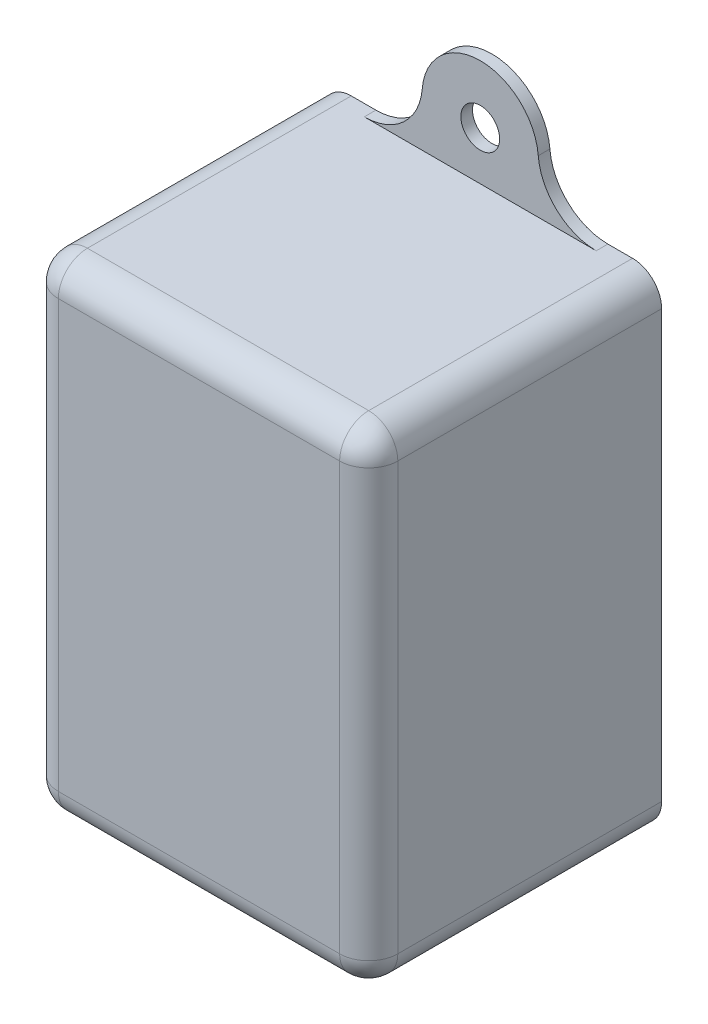
ISO-10303-21;
HEADER;
FILE_DESCRIPTION(('STEP AP214'),'2;1');
FILE_NAME('part.step','',(''),(''),'','','');
FILE_SCHEMA(('AUTOMOTIVE_DESIGN { 1 0 10303 214 1 1 1 1 }'));
ENDSEC;
DATA;
#1=APPLICATION_CONTEXT('core data for automotive mechanical design processes');
#2=APPLICATION_PROTOCOL_DEFINITION('international standard','automotive_design',2000,#1);
#3=PRODUCT_CONTEXT('',#1,'mechanical');
#4=PRODUCT('Part','Part','',(#3));
#5=PRODUCT_RELATED_PRODUCT_CATEGORY('part','',(#4));
#6=PRODUCT_DEFINITION_FORMATION('','',#4);
#7=PRODUCT_DEFINITION_CONTEXT('part definition',#1,'design');
#8=PRODUCT_DEFINITION('design','',#6,#7);
#9=PRODUCT_DEFINITION_SHAPE('','',#8);
#10=(LENGTH_UNIT() NAMED_UNIT(*) SI_UNIT(.MILLI.,.METRE.));
#11=(NAMED_UNIT(*) PLANE_ANGLE_UNIT() SI_UNIT($,.RADIAN.));
#12=(NAMED_UNIT(*) SI_UNIT($,.STERADIAN.) SOLID_ANGLE_UNIT());
#13=UNCERTAINTY_MEASURE_WITH_UNIT(LENGTH_MEASURE(1.E-05),#10,'distance_accuracy_value','');
#14=(GEOMETRIC_REPRESENTATION_CONTEXT(3) GLOBAL_UNCERTAINTY_ASSIGNED_CONTEXT((#13)) GLOBAL_UNIT_ASSIGNED_CONTEXT((#10,
#11,#12)) REPRESENTATION_CONTEXT('',''));
#15=CARTESIAN_POINT('',(0.,0.,0.));
#16=DIRECTION('',(0.,0.,1.));
#17=DIRECTION('',(1.,0.,0.));
#18=AXIS2_PLACEMENT_3D('',#15,#16,#17);
#19=CARTESIAN_POINT('',(-11.9582607431014,31.,1.2));
#20=DIRECTION('',(0.,0.,-1.));
#21=DIRECTION('',(-1.,0.,0.));
#22=AXIS2_PLACEMENT_3D('',#19,#20,#21);
#23=PLANE('',#22);
#24=CARTESIAN_POINT('',(0.,30.,1.2));
#25=DIRECTION('',(0.,0.,1.));
#26=DIRECTION('',(1.,0.,0.));
#27=AXIS2_PLACEMENT_3D('',#24,#25,#26);
#28=CIRCLE('',#27,2.);
#29=CARTESIAN_POINT('',(2.00000000000001,30.,1.2));
#30=VERTEX_POINT('',#29);
#31=EDGE_CURVE('E179',#30,#30,#28,.T.);
#32=ORIENTED_EDGE('',*,*,#31,.F.);
#33=EDGE_LOOP('',(#32));
#34=FACE_BOUND('',#33,.T.);
#35=DIRECTION('',(-1.,0.,0.));
#36=VECTOR('',#35,1.);
#37=CARTESIAN_POINT('',(-17.5,25.,1.2));
#38=LINE('',#37,#36);
#39=CARTESIAN_POINT('',(11.9582607431014,25.,1.2));
#40=VERTEX_POINT('',#39);
#41=CARTESIAN_POINT('',(-11.9582607431014,25.,1.2));
#42=VERTEX_POINT('',#41);
#43=EDGE_CURVE('E170',#40,#42,#38,.T.);
#44=ORIENTED_EDGE('',*,*,#43,.F.);
#45=CARTESIAN_POINT('',(11.9582607431014,31.,1.2));
#46=DIRECTION('',(0.,0.,-1.));
#47=DIRECTION('',(1.,0.,0.));
#48=AXIS2_PLACEMENT_3D('',#45,#46,#47);
#49=CIRCLE('',#48,6.);
#50=CARTESIAN_POINT('',(5.97913037155071,30.5,1.2));
#51=VERTEX_POINT('',#50);
#52=EDGE_CURVE('E214',#40,#51,#49,.T.);
#53=ORIENTED_EDGE('',*,*,#52,.T.);
#54=CARTESIAN_POINT('',(0.,30.,1.2));
#55=DIRECTION('',(0.,0.,1.));
#56=DIRECTION('',(1.,0.,0.));
#57=AXIS2_PLACEMENT_3D('',#54,#55,#56);
#58=CIRCLE('',#57,6.);
#59=CARTESIAN_POINT('',(-5.97913037155069,30.5,1.2));
#60=VERTEX_POINT('',#59);
#61=EDGE_CURVE('E212',#51,#60,#58,.T.);
#62=ORIENTED_EDGE('',*,*,#61,.T.);
#63=CARTESIAN_POINT('',(-11.9582607431014,31.,1.2));
#64=DIRECTION('',(0.,0.,-1.));
#65=DIRECTION('',(-1.,0.,0.));
#66=AXIS2_PLACEMENT_3D('',#63,#64,#65);
#67=CIRCLE('',#66,6.);
#68=EDGE_CURVE('E207',#60,#42,#67,.T.);
#69=ORIENTED_EDGE('',*,*,#68,.T.);
#70=EDGE_LOOP('',(#44,#53,#62,#69));
#71=FACE_BOUND('',#70,.T.);
#72=ADVANCED_FACE('F28',(#34,#71),#23,.F.);
#73=CARTESIAN_POINT('',(0.,-30.,1.2));
#74=DIRECTION('',(0.,0.,1.));
#75=DIRECTION('',(-1.,0.,0.));
#76=AXIS2_PLACEMENT_3D('',#73,#74,#75);
#77=CIRCLE('',#76,2.);
#78=CARTESIAN_POINT('',(-2.,-30.,1.2));
#79=VERTEX_POINT('',#78);
#80=EDGE_CURVE('E342',#79,#79,#77,.T.);
#81=ORIENTED_EDGE('',*,*,#80,.F.);
#82=EDGE_LOOP('',(#81));
#83=FACE_BOUND('',#82,.T.);
#84=DIRECTION('',(1.,0.,0.));
#85=VECTOR('',#84,1.);
#86=CARTESIAN_POINT('',(-17.5,-25.,1.2));
#87=LINE('',#86,#85);
#88=CARTESIAN_POINT('',(-11.9582607431014,-25.,1.2));
#89=VERTEX_POINT('',#88);
#90=CARTESIAN_POINT('',(11.9582607431014,-25.,1.2));
#91=VERTEX_POINT('',#90);
#92=EDGE_CURVE('E173',#89,#91,#87,.T.);
#93=ORIENTED_EDGE('',*,*,#92,.F.);
#94=CARTESIAN_POINT('',(-11.9582607431014,-31.,1.2));
#95=DIRECTION('',(0.,0.,-1.));
#96=DIRECTION('',(1.,0.,0.));
#97=AXIS2_PLACEMENT_3D('',#94,#95,#96);
#98=CIRCLE('',#97,6.);
#99=CARTESIAN_POINT('',(-5.97913037155068,-30.5,1.2));
#100=VERTEX_POINT('',#99);
#101=EDGE_CURVE('E211',#89,#100,#98,.T.);
#102=ORIENTED_EDGE('',*,*,#101,.T.);
#103=CARTESIAN_POINT('',(0.,-30.,1.2));
#104=DIRECTION('',(0.,0.,1.));
#105=DIRECTION('',(-1.,0.,0.));
#106=AXIS2_PLACEMENT_3D('',#103,#104,#105);
#107=CIRCLE('',#106,6.);
#108=CARTESIAN_POINT('',(5.97913037155071,-30.5,1.2));
#109=VERTEX_POINT('',#108);
#110=EDGE_CURVE('E208',#100,#109,#107,.T.);
#111=ORIENTED_EDGE('',*,*,#110,.T.);
#112=CARTESIAN_POINT('',(11.9582607431014,-31.,1.2));
#113=DIRECTION('',(0.,0.,-1.));
#114=DIRECTION('',(-1.,0.,0.));
#115=AXIS2_PLACEMENT_3D('',#112,#113,#114);
#116=CIRCLE('',#115,6.);
#117=EDGE_CURVE('E210',#109,#91,#116,.T.);
#118=ORIENTED_EDGE('',*,*,#117,.T.);
#119=EDGE_LOOP('',(#93,#102,#111,#118));
#120=FACE_BOUND('',#119,.T.);
#121=ADVANCED_FACE('F366',(#83,#120),#23,.F.);
#122=CARTESIAN_POINT('',(-11.9582607431014,31.,0.));
#123=DIRECTION('',(0.,0.,-1.));
#124=DIRECTION('',(-1.,0.,0.));
#125=AXIS2_PLACEMENT_3D('',#122,#123,#124);
#126=PLANE('',#125);
#127=CARTESIAN_POINT('',(0.,30.,0.));
#128=DIRECTION('',(0.,0.,1.));
#129=DIRECTION('',(1.,0.,0.));
#130=AXIS2_PLACEMENT_3D('',#127,#128,#129);
#131=CIRCLE('',#130,2.);
#132=CARTESIAN_POINT('',(2.00000000000001,30.,0.));
#133=VERTEX_POINT('',#132);
#134=EDGE_CURVE('E182',#133,#133,#131,.T.);
#135=ORIENTED_EDGE('',*,*,#134,.T.);
#136=EDGE_LOOP('',(#135));
#137=FACE_BOUND('',#136,.T.);
#138=DIRECTION('',(0.,-1.,0.));
#139=VECTOR('',#138,1.);
#140=CARTESIAN_POINT('',(-17.5,25.,0.));
#141=LINE('',#140,#139);
#142=CARTESIAN_POINT('',(-17.5,22.,0.));
#143=VERTEX_POINT('',#142);
#144=CARTESIAN_POINT('',(-17.5,-22.,0.));
#145=VERTEX_POINT('',#144);
#146=EDGE_CURVE('E163',#143,#145,#141,.T.);
#147=ORIENTED_EDGE('',*,*,#146,.F.);
#148=CARTESIAN_POINT('',(-14.5,22.,0.));
#149=DIRECTION('',(0.,0.,-1.));
#150=DIRECTION('',(-1.,0.,0.));
#151=AXIS2_PLACEMENT_3D('',#148,#149,#150);
#152=CIRCLE('',#151,3.);
#153=CARTESIAN_POINT('',(-14.5,25.,0.));
#154=VERTEX_POINT('',#153);
#155=EDGE_CURVE('E11',#143,#154,#152,.T.);
#156=ORIENTED_EDGE('',*,*,#155,.T.);
#157=DIRECTION('',(-1.,0.,0.));
#158=VECTOR('',#157,1.);
#159=CARTESIAN_POINT('',(-11.9582607431014,25.,0.));
#160=LINE('',#159,#158);
#161=CARTESIAN_POINT('',(-11.9582607431014,25.,0.));
#162=VERTEX_POINT('',#161);
#163=EDGE_CURVE('E152',#162,#154,#160,.T.);
#164=ORIENTED_EDGE('',*,*,#163,.F.);
#165=CARTESIAN_POINT('',(-11.9582607431014,31.,0.));
#166=DIRECTION('',(0.,0.,-1.));
#167=DIRECTION('',(-1.,0.,0.));
#168=AXIS2_PLACEMENT_3D('',#165,#166,#167);
#169=CIRCLE('',#168,6.);
#170=CARTESIAN_POINT('',(-5.97913037155069,30.5,0.));
#171=VERTEX_POINT('',#170);
#172=EDGE_CURVE('E159',#171,#162,#169,.T.);
#173=ORIENTED_EDGE('',*,*,#172,.F.);
#174=CARTESIAN_POINT('',(0.,30.,0.));
#175=DIRECTION('',(0.,0.,1.));
#176=DIRECTION('',(1.,0.,0.));
#177=AXIS2_PLACEMENT_3D('',#174,#175,#176);
#178=CIRCLE('',#177,6.);
#179=CARTESIAN_POINT('',(5.97913037155071,30.5,0.));
#180=VERTEX_POINT('',#179);
#181=EDGE_CURVE('E205',#180,#171,#178,.T.);
#182=ORIENTED_EDGE('',*,*,#181,.F.);
#183=CARTESIAN_POINT('',(11.9582607431014,31.,0.));
#184=DIRECTION('',(0.,0.,-1.));
#185=DIRECTION('',(1.,0.,0.));
#186=AXIS2_PLACEMENT_3D('',#183,#184,#185);
#187=CIRCLE('',#186,6.);
#188=CARTESIAN_POINT('',(11.9582607431014,25.,0.));
#189=VERTEX_POINT('',#188);
#190=EDGE_CURVE('E203',#189,#180,#187,.T.);
#191=ORIENTED_EDGE('',*,*,#190,.F.);
#192=DIRECTION('',(-1.,0.,0.));
#193=VECTOR('',#192,1.);
#194=CARTESIAN_POINT('',(11.9582607431014,25.,0.));
#195=LINE('',#194,#193);
#196=CARTESIAN_POINT('',(14.5,25.,0.));
#197=VERTEX_POINT('',#196);
#198=EDGE_CURVE('E201',#197,#189,#195,.T.);
#199=ORIENTED_EDGE('',*,*,#198,.F.);
#200=CARTESIAN_POINT('',(14.5,22.,0.));
#201=DIRECTION('',(0.,0.,-1.));
#202=DIRECTION('',(-1.,0.,0.));
#203=AXIS2_PLACEMENT_3D('',#200,#201,#202);
#204=CIRCLE('',#203,3.);
#205=CARTESIAN_POINT('',(17.5,22.,0.));
#206=VERTEX_POINT('',#205);
#207=EDGE_CURVE('E280',#197,#206,#204,.T.);
#208=ORIENTED_EDGE('',*,*,#207,.T.);
#209=DIRECTION('',(0.,1.,0.));
#210=VECTOR('',#209,1.);
#211=CARTESIAN_POINT('',(17.5,-25.,0.));
#212=LINE('',#211,#210);
#213=CARTESIAN_POINT('',(17.5,-22.,0.));
#214=VERTEX_POINT('',#213);
#215=EDGE_CURVE('E198',#214,#206,#212,.T.);
#216=ORIENTED_EDGE('',*,*,#215,.F.);
#217=CARTESIAN_POINT('',(14.5,-22.,0.));
#218=DIRECTION('',(0.,0.,-1.));
#219=DIRECTION('',(-1.,0.,0.));
#220=AXIS2_PLACEMENT_3D('',#217,#218,#219);
#221=CIRCLE('',#220,3.);
#222=CARTESIAN_POINT('',(14.5,-25.,0.));
#223=VERTEX_POINT('',#222);
#224=EDGE_CURVE('E282',#214,#223,#221,.T.);
#225=ORIENTED_EDGE('',*,*,#224,.T.);
#226=DIRECTION('',(1.,0.,0.));
#227=VECTOR('',#226,1.);
#228=CARTESIAN_POINT('',(11.9582607431014,-25.,0.));
#229=LINE('',#228,#227);
#230=CARTESIAN_POINT('',(11.9582607431014,-25.,0.));
#231=VERTEX_POINT('',#230);
#232=EDGE_CURVE('E195',#231,#223,#229,.T.);
#233=ORIENTED_EDGE('',*,*,#232,.F.);
#234=CARTESIAN_POINT('',(11.9582607431014,-31.,0.));
#235=DIRECTION('',(0.,0.,-1.));
#236=DIRECTION('',(-1.,0.,0.));
#237=AXIS2_PLACEMENT_3D('',#234,#235,#236);
#238=CIRCLE('',#237,6.);
#239=CARTESIAN_POINT('',(5.97913037155071,-30.5,0.));
#240=VERTEX_POINT('',#239);
#241=EDGE_CURVE('E193',#240,#231,#238,.T.);
#242=ORIENTED_EDGE('',*,*,#241,.F.);
#243=CARTESIAN_POINT('',(0.,-30.,0.));
#244=DIRECTION('',(0.,0.,1.));
#245=DIRECTION('',(-1.,0.,0.));
#246=AXIS2_PLACEMENT_3D('',#243,#244,#245);
#247=CIRCLE('',#246,6.);
#248=CARTESIAN_POINT('',(-5.97913037155068,-30.5,0.));
#249=VERTEX_POINT('',#248);
#250=EDGE_CURVE('E191',#249,#240,#247,.T.);
#251=ORIENTED_EDGE('',*,*,#250,.F.);
#252=CARTESIAN_POINT('',(-11.9582607431014,-31.,0.));
#253=DIRECTION('',(0.,0.,-1.));
#254=DIRECTION('',(1.,0.,0.));
#255=AXIS2_PLACEMENT_3D('',#252,#253,#254);
#256=CIRCLE('',#255,6.);
#257=CARTESIAN_POINT('',(-11.9582607431014,-25.,0.));
#258=VERTEX_POINT('',#257);
#259=EDGE_CURVE('E189',#258,#249,#256,.T.);
#260=ORIENTED_EDGE('',*,*,#259,.F.);
#261=DIRECTION('',(1.,0.,0.));
#262=VECTOR('',#261,1.);
#263=CARTESIAN_POINT('',(-11.9582607431014,-25.,0.));
#264=LINE('',#263,#262);
#265=CARTESIAN_POINT('',(-14.5,-25.,0.));
#266=VERTEX_POINT('',#265);
#267=EDGE_CURVE('E187',#266,#258,#264,.T.);
#268=ORIENTED_EDGE('',*,*,#267,.F.);
#269=CARTESIAN_POINT('',(-14.5,-22.,0.));
#270=DIRECTION('',(0.,0.,-1.));
#271=DIRECTION('',(-1.,0.,0.));
#272=AXIS2_PLACEMENT_3D('',#269,#270,#271);
#273=CIRCLE('',#272,3.);
#274=EDGE_CURVE('E36',#266,#145,#273,.T.);
#275=ORIENTED_EDGE('',*,*,#274,.T.);
#276=EDGE_LOOP('',(#147,#156,#164,#173,#182,#191,#199,#208,#216,#225,#233,#242,#251,#260,#268,#275));
#277=FACE_BOUND('',#276,.T.);
#278=CARTESIAN_POINT('',(0.,-30.,0.));
#279=DIRECTION('',(0.,0.,1.));
#280=DIRECTION('',(-1.,0.,0.));
#281=AXIS2_PLACEMENT_3D('',#278,#279,#280);
#282=CIRCLE('',#281,2.);
#283=CARTESIAN_POINT('',(-2.,-30.,0.));
#284=VERTEX_POINT('',#283);
#285=EDGE_CURVE('E339',#284,#284,#282,.T.);
#286=ORIENTED_EDGE('',*,*,#285,.T.);
#287=EDGE_LOOP('',(#286));
#288=FACE_BOUND('',#287,.T.);
#289=ADVANCED_FACE('F155',(#137,#277,#288),#126,.T.);
#290=CARTESIAN_POINT('',(-11.9582607431014,31.,1.2));
#291=DIRECTION('',(0.,0.,-1.));
#292=DIRECTION('',(-1.,0.,0.));
#293=AXIS2_PLACEMENT_3D('',#290,#291,#292);
#294=CYLINDRICAL_SURFACE('',#293,6.);
#295=ORIENTED_EDGE('',*,*,#172,.T.);
#296=DIRECTION('',(0.,0.,-1.));
#297=VECTOR('',#296,1.);
#298=CARTESIAN_POINT('',(-11.9582607431014,25.,1.2));
#299=LINE('',#298,#297);
#300=EDGE_CURVE('E167',#42,#162,#299,.T.);
#301=ORIENTED_EDGE('',*,*,#300,.F.);
#302=ORIENTED_EDGE('',*,*,#68,.F.);
#303=DIRECTION('',(0.,0.,-1.));
#304=VECTOR('',#303,1.);
#305=CARTESIAN_POINT('',(-5.97913037155069,30.5,1.2));
#306=LINE('',#305,#304);
#307=EDGE_CURVE('E178',#60,#171,#306,.T.);
#308=ORIENTED_EDGE('',*,*,#307,.T.);
#309=EDGE_LOOP('',(#295,#301,#302,#308));
#310=FACE_BOUND('',#309,.T.);
#311=ADVANCED_FACE('F30',(#310),#294,.F.);
#312=CARTESIAN_POINT('',(-17.5,25.,1.2));
#313=DIRECTION('',(1.,0.,0.));
#314=DIRECTION('',(0.,0.,-1.));
#315=AXIS2_PLACEMENT_3D('',#312,#313,#314);
#316=PLANE('',#315);
#317=DIRECTION('',(0.,-1.,0.));
#318=VECTOR('',#317,1.);
#319=CARTESIAN_POINT('',(-17.5,25.,27.2));
#320=LINE('',#319,#318);
#321=CARTESIAN_POINT('',(-17.5,-22.,27.2));
#322=VERTEX_POINT('',#321);
#323=CARTESIAN_POINT('',(-17.5,22.,27.2));
#324=VERTEX_POINT('',#323);
#325=EDGE_CURVE('E43',#322,#324,#320,.F.);
#326=ORIENTED_EDGE('',*,*,#325,.T.);
#327=DIRECTION('',(0.,0.,-1.));
#328=VECTOR('',#327,1.);
#329=CARTESIAN_POINT('',(-17.5,22.,1.2));
#330=LINE('',#329,#328);
#331=EDGE_CURVE('E278',#324,#143,#330,.T.);
#332=ORIENTED_EDGE('',*,*,#331,.T.);
#333=ORIENTED_EDGE('',*,*,#146,.T.);
#334=DIRECTION('',(0.,0.,-1.));
#335=VECTOR('',#334,1.);
#336=CARTESIAN_POINT('',(-17.5,-22.,1.2));
#337=LINE('',#336,#335);
#338=EDGE_CURVE('E48',#145,#322,#337,.F.);
#339=ORIENTED_EDGE('',*,*,#338,.T.);
#340=EDGE_LOOP('',(#326,#332,#333,#339));
#341=FACE_BOUND('',#340,.T.);
#342=ADVANCED_FACE('F288',(#341),#316,.F.);
#343=CARTESIAN_POINT('',(-11.9582607431014,-31.,1.2));
#344=DIRECTION('',(0.,0.,-1.));
#345=DIRECTION('',(-1.,0.,0.));
#346=AXIS2_PLACEMENT_3D('',#343,#344,#345);
#347=CYLINDRICAL_SURFACE('',#346,6.);
#348=ORIENTED_EDGE('',*,*,#259,.T.);
#349=DIRECTION('',(0.,0.,-1.));
#350=VECTOR('',#349,1.);
#351=CARTESIAN_POINT('',(-5.97913037155068,-30.5,1.2));
#352=LINE('',#351,#350);
#353=EDGE_CURVE('E223',#100,#249,#352,.T.);
#354=ORIENTED_EDGE('',*,*,#353,.F.);
#355=ORIENTED_EDGE('',*,*,#101,.F.);
#356=DIRECTION('',(0.,0.,-1.));
#357=VECTOR('',#356,1.);
#358=CARTESIAN_POINT('',(-11.9582607431014,-25.,1.2));
#359=LINE('',#358,#357);
#360=EDGE_CURVE('E174',#89,#258,#359,.T.);
#361=ORIENTED_EDGE('',*,*,#360,.T.);
#362=EDGE_LOOP('',(#348,#354,#355,#361));
#363=FACE_BOUND('',#362,.T.);
#364=ADVANCED_FACE('F396',(#363),#347,.F.);
#365=CARTESIAN_POINT('',(0.,-30.,1.2));
#366=DIRECTION('',(0.,0.,-1.));
#367=DIRECTION('',(-1.,0.,0.));
#368=AXIS2_PLACEMENT_3D('',#365,#366,#367);
#369=CYLINDRICAL_SURFACE('',#368,6.);
#370=ORIENTED_EDGE('',*,*,#250,.T.);
#371=DIRECTION('',(0.,0.,-1.));
#372=VECTOR('',#371,1.);
#373=CARTESIAN_POINT('',(5.97913037155071,-30.5,1.2));
#374=LINE('',#373,#372);
#375=EDGE_CURVE('E220',#109,#240,#374,.T.);
#376=ORIENTED_EDGE('',*,*,#375,.F.);
#377=ORIENTED_EDGE('',*,*,#110,.F.);
#378=ORIENTED_EDGE('',*,*,#353,.T.);
#379=EDGE_LOOP('',(#370,#376,#377,#378));
#380=FACE_BOUND('',#379,.T.);
#381=ADVANCED_FACE('F392',(#380),#369,.T.);
#382=CARTESIAN_POINT('',(11.9582607431014,-31.,1.2));
#383=DIRECTION('',(0.,0.,-1.));
#384=DIRECTION('',(-1.,0.,0.));
#385=AXIS2_PLACEMENT_3D('',#382,#383,#384);
#386=CYLINDRICAL_SURFACE('',#385,6.);
#387=ORIENTED_EDGE('',*,*,#241,.T.);
#388=DIRECTION('',(0.,0.,-1.));
#389=VECTOR('',#388,1.);
#390=CARTESIAN_POINT('',(11.9582607431014,-25.,1.2));
#391=LINE('',#390,#389);
#392=EDGE_CURVE('E224',#91,#231,#391,.T.);
#393=ORIENTED_EDGE('',*,*,#392,.F.);
#394=ORIENTED_EDGE('',*,*,#117,.F.);
#395=ORIENTED_EDGE('',*,*,#375,.T.);
#396=EDGE_LOOP('',(#387,#393,#394,#395));
#397=FACE_BOUND('',#396,.T.);
#398=ADVANCED_FACE('F388',(#397),#386,.F.);
#399=CARTESIAN_POINT('',(11.9582607431014,-25.,1.2));
#400=DIRECTION('',(0.,1.,0.));
#401=DIRECTION('',(0.,0.,1.));
#402=AXIS2_PLACEMENT_3D('',#399,#400,#401);
#403=PLANE('',#402);
#404=DIRECTION('',(1.,0.,0.));
#405=VECTOR('',#404,1.);
#406=CARTESIAN_POINT('',(-17.5,-25.,27.2));
#407=LINE('',#406,#405);
#408=CARTESIAN_POINT('',(14.5,-25.,27.2));
#409=VERTEX_POINT('',#408);
#410=CARTESIAN_POINT('',(-14.5,-25.,27.2));
#411=VERTEX_POINT('',#410);
#412=EDGE_CURVE('E272',#409,#411,#407,.F.);
#413=ORIENTED_EDGE('',*,*,#412,.T.);
#414=DIRECTION('',(0.,0.,-1.));
#415=VECTOR('',#414,1.);
#416=CARTESIAN_POINT('',(-14.5,-25.,1.2));
#417=LINE('',#416,#415);
#418=EDGE_CURVE('E274',#411,#266,#417,.T.);
#419=ORIENTED_EDGE('',*,*,#418,.T.);
#420=ORIENTED_EDGE('',*,*,#267,.T.);
#421=ORIENTED_EDGE('',*,*,#360,.F.);
#422=ORIENTED_EDGE('',*,*,#92,.T.);
#423=ORIENTED_EDGE('',*,*,#392,.T.);
#424=ORIENTED_EDGE('',*,*,#232,.T.);
#425=DIRECTION('',(0.,0.,-1.));
#426=VECTOR('',#425,1.);
#427=CARTESIAN_POINT('',(14.5,-25.,1.2));
#428=LINE('',#427,#426);
#429=EDGE_CURVE('E270',#223,#409,#428,.F.);
#430=ORIENTED_EDGE('',*,*,#429,.T.);
#431=EDGE_LOOP('',(#413,#419,#420,#421,#422,#423,#424,#430));
#432=FACE_BOUND('',#431,.T.);
#433=ADVANCED_FACE('F384',(#432),#403,.F.);
#434=CARTESIAN_POINT('',(17.5,-25.,1.2));
#435=DIRECTION('',(-1.,0.,0.));
#436=DIRECTION('',(0.,0.,1.));
#437=AXIS2_PLACEMENT_3D('',#434,#435,#436);
#438=PLANE('',#437);
#439=DIRECTION('',(0.,1.,0.));
#440=VECTOR('',#439,1.);
#441=CARTESIAN_POINT('',(17.5,-25.,27.2));
#442=LINE('',#441,#440);
#443=CARTESIAN_POINT('',(17.5,22.,27.2));
#444=VERTEX_POINT('',#443);
#445=CARTESIAN_POINT('',(17.5,-22.,27.2));
#446=VERTEX_POINT('',#445);
#447=EDGE_CURVE('E266',#444,#446,#442,.F.);
#448=ORIENTED_EDGE('',*,*,#447,.T.);
#449=DIRECTION('',(0.,0.,-1.));
#450=VECTOR('',#449,1.);
#451=CARTESIAN_POINT('',(17.5,-22.,1.2));
#452=LINE('',#451,#450);
#453=EDGE_CURVE('E268',#446,#214,#452,.T.);
#454=ORIENTED_EDGE('',*,*,#453,.T.);
#455=ORIENTED_EDGE('',*,*,#215,.T.);
#456=DIRECTION('',(0.,0.,-1.));
#457=VECTOR('',#456,1.);
#458=CARTESIAN_POINT('',(17.5,22.,1.2));
#459=LINE('',#458,#457);
#460=EDGE_CURVE('E264',#206,#444,#459,.F.);
#461=ORIENTED_EDGE('',*,*,#460,.T.);
#462=EDGE_LOOP('',(#448,#454,#455,#461));
#463=FACE_BOUND('',#462,.T.);
#464=ADVANCED_FACE('F381',(#463),#438,.F.);
#465=CARTESIAN_POINT('',(11.9582607431014,25.,1.2));
#466=DIRECTION('',(0.,-1.,0.));
#467=DIRECTION('',(0.,0.,-1.));
#468=AXIS2_PLACEMENT_3D('',#465,#466,#467);
#469=PLANE('',#468);
#470=ORIENTED_EDGE('',*,*,#163,.T.);
#471=DIRECTION('',(0.,0.,-1.));
#472=VECTOR('',#471,1.);
#473=CARTESIAN_POINT('',(-14.5,25.,1.2));
#474=LINE('',#473,#472);
#475=CARTESIAN_POINT('',(-14.5,25.,27.2));
#476=VERTEX_POINT('',#475);
#477=EDGE_CURVE('E262',#154,#476,#474,.F.);
#478=ORIENTED_EDGE('',*,*,#477,.T.);
#479=DIRECTION('',(-1.,0.,0.));
#480=VECTOR('',#479,1.);
#481=CARTESIAN_POINT('',(17.5,25.,27.2));
#482=LINE('',#481,#480);
#483=CARTESIAN_POINT('',(14.5,25.,27.2));
#484=VERTEX_POINT('',#483);
#485=EDGE_CURVE('E259',#476,#484,#482,.F.);
#486=ORIENTED_EDGE('',*,*,#485,.T.);
#487=DIRECTION('',(0.,0.,-1.));
#488=VECTOR('',#487,1.);
#489=CARTESIAN_POINT('',(14.5,25.,1.2));
#490=LINE('',#489,#488);
#491=EDGE_CURVE('E257',#484,#197,#490,.T.);
#492=ORIENTED_EDGE('',*,*,#491,.T.);
#493=ORIENTED_EDGE('',*,*,#198,.T.);
#494=DIRECTION('',(0.,0.,-1.));
#495=VECTOR('',#494,1.);
#496=CARTESIAN_POINT('',(11.9582607431014,25.,1.2));
#497=LINE('',#496,#495);
#498=EDGE_CURVE('E219',#40,#189,#497,.T.);
#499=ORIENTED_EDGE('',*,*,#498,.F.);
#500=ORIENTED_EDGE('',*,*,#43,.T.);
#501=ORIENTED_EDGE('',*,*,#300,.T.);
#502=EDGE_LOOP('',(#470,#478,#486,#492,#493,#499,#500,#501));
#503=FACE_BOUND('',#502,.T.);
#504=ADVANCED_FACE('F168',(#503),#469,.F.);
#505=CARTESIAN_POINT('',(11.9582607431014,31.,1.2));
#506=DIRECTION('',(0.,0.,-1.));
#507=DIRECTION('',(-1.,0.,0.));
#508=AXIS2_PLACEMENT_3D('',#505,#506,#507);
#509=CYLINDRICAL_SURFACE('',#508,6.);
#510=ORIENTED_EDGE('',*,*,#190,.T.);
#511=DIRECTION('',(0.,0.,-1.));
#512=VECTOR('',#511,1.);
#513=CARTESIAN_POINT('',(5.97913037155071,30.5,1.2));
#514=LINE('',#513,#512);
#515=EDGE_CURVE('E216',#51,#180,#514,.T.);
#516=ORIENTED_EDGE('',*,*,#515,.F.);
#517=ORIENTED_EDGE('',*,*,#52,.F.);
#518=ORIENTED_EDGE('',*,*,#498,.T.);
#519=EDGE_LOOP('',(#510,#516,#517,#518));
#520=FACE_BOUND('',#519,.T.);
#521=ADVANCED_FACE('F361',(#520),#509,.F.);
#522=CARTESIAN_POINT('',(0.,30.,1.2));
#523=DIRECTION('',(0.,0.,-1.));
#524=DIRECTION('',(-1.,0.,0.));
#525=AXIS2_PLACEMENT_3D('',#522,#523,#524);
#526=CYLINDRICAL_SURFACE('',#525,6.);
#527=ORIENTED_EDGE('',*,*,#181,.T.);
#528=ORIENTED_EDGE('',*,*,#307,.F.);
#529=ORIENTED_EDGE('',*,*,#61,.F.);
#530=ORIENTED_EDGE('',*,*,#515,.T.);
#531=EDGE_LOOP('',(#527,#528,#529,#530));
#532=FACE_BOUND('',#531,.T.);
#533=ADVANCED_FACE('F351',(#532),#526,.T.);
#534=CARTESIAN_POINT('',(0.,30.,1.2));
#535=DIRECTION('',(0.,0.,-1.));
#536=DIRECTION('',(-1.,0.,0.));
#537=AXIS2_PLACEMENT_3D('',#534,#535,#536);
#538=CYLINDRICAL_SURFACE('',#537,2.);
#539=ORIENTED_EDGE('',*,*,#31,.T.);
#540=EDGE_LOOP('',(#539));
#541=FACE_BOUND('',#540,.T.);
#542=ORIENTED_EDGE('',*,*,#134,.F.);
#543=EDGE_LOOP('',(#542));
#544=FACE_BOUND('',#543,.T.);
#545=ADVANCED_FACE('F348',(#541,#544),#538,.F.);
#546=CARTESIAN_POINT('',(0.,-30.,1.2));
#547=DIRECTION('',(0.,0.,-1.));
#548=DIRECTION('',(-1.,0.,0.));
#549=AXIS2_PLACEMENT_3D('',#546,#547,#548);
#550=CYLINDRICAL_SURFACE('',#549,2.);
#551=ORIENTED_EDGE('',*,*,#80,.T.);
#552=EDGE_LOOP('',(#551));
#553=FACE_BOUND('',#552,.T.);
#554=ORIENTED_EDGE('',*,*,#285,.F.);
#555=EDGE_LOOP('',(#554));
#556=FACE_BOUND('',#555,.T.);
#557=ADVANCED_FACE('F350',(#553,#556),#550,.F.);
#558=CARTESIAN_POINT('',(-17.5,-25.,30.2));
#559=DIRECTION('',(0.,0.,1.));
#560=DIRECTION('',(1.,0.,0.));
#561=AXIS2_PLACEMENT_3D('',#558,#559,#560);
#562=PLANE('',#561);
#563=DIRECTION('',(0.,1.,0.));
#564=VECTOR('',#563,1.);
#565=CARTESIAN_POINT('',(14.5,25.,30.2));
#566=LINE('',#565,#564);
#567=CARTESIAN_POINT('',(14.5,-22.,30.2));
#568=VERTEX_POINT('',#567);
#569=CARTESIAN_POINT('',(14.5,22.,30.2));
#570=VERTEX_POINT('',#569);
#571=EDGE_CURVE('E252',#568,#570,#566,.T.);
#572=ORIENTED_EDGE('',*,*,#571,.T.);
#573=DIRECTION('',(-1.,0.,0.));
#574=VECTOR('',#573,1.);
#575=CARTESIAN_POINT('',(-17.5,22.,30.2));
#576=LINE('',#575,#574);
#577=CARTESIAN_POINT('',(-14.5,22.,30.2));
#578=VERTEX_POINT('',#577);
#579=EDGE_CURVE('E254',#570,#578,#576,.T.);
#580=ORIENTED_EDGE('',*,*,#579,.T.);
#581=DIRECTION('',(0.,-1.,0.));
#582=VECTOR('',#581,1.);
#583=CARTESIAN_POINT('',(-14.5,-25.,30.2));
#584=LINE('',#583,#582);
#585=CARTESIAN_POINT('',(-14.5,-22.,30.2));
#586=VERTEX_POINT('',#585);
#587=EDGE_CURVE('E234',#578,#586,#584,.T.);
#588=ORIENTED_EDGE('',*,*,#587,.T.);
#589=DIRECTION('',(1.,0.,0.));
#590=VECTOR('',#589,1.);
#591=CARTESIAN_POINT('',(17.5,-22.,30.2));
#592=LINE('',#591,#590);
#593=EDGE_CURVE('E250',#586,#568,#592,.T.);
#594=ORIENTED_EDGE('',*,*,#593,.T.);
#595=EDGE_LOOP('',(#572,#580,#588,#594));
#596=FACE_BOUND('',#595,.T.);
#597=ADVANCED_FACE('F358',(#596),#562,.T.);
#598=CARTESIAN_POINT('',(14.5,-22.,1.2));
#599=DIRECTION('',(0.,0.,-1.));
#600=DIRECTION('',(-1.,0.,0.));
#601=AXIS2_PLACEMENT_3D('',#598,#599,#600);
#602=CYLINDRICAL_SURFACE('',#601,3.);
#603=ORIENTED_EDGE('',*,*,#224,.F.);
#604=ORIENTED_EDGE('',*,*,#453,.F.);
#605=CARTESIAN_POINT('',(14.5,-22.,27.2));
#606=DIRECTION('',(0.,0.,1.));
#607=DIRECTION('',(1.,0.,0.));
#608=AXIS2_PLACEMENT_3D('',#605,#606,#607);
#609=CIRCLE('',#608,3.);
#610=EDGE_CURVE('E336',#409,#446,#609,.T.);
#611=ORIENTED_EDGE('',*,*,#610,.F.);
#612=ORIENTED_EDGE('',*,*,#429,.F.);
#613=EDGE_LOOP('',(#603,#604,#611,#612));
#614=FACE_BOUND('',#613,.T.);
#615=ADVANCED_FACE('F476',(#614),#602,.T.);
#616=CARTESIAN_POINT('',(-17.5,-22.,27.2));
#617=DIRECTION('',(-1.,0.,0.));
#618=DIRECTION('',(0.,0.,1.));
#619=AXIS2_PLACEMENT_3D('',#616,#617,#618);
#620=CYLINDRICAL_SURFACE('',#619,3.);
#621=CARTESIAN_POINT('',(-14.5,-22.,27.2));
#622=DIRECTION('',(-1.,0.,0.));
#623=DIRECTION('',(0.,0.,1.));
#624=AXIS2_PLACEMENT_3D('',#621,#622,#623);
#625=CIRCLE('',#624,3.);
#626=EDGE_CURVE('E296',#411,#586,#625,.T.);
#627=ORIENTED_EDGE('',*,*,#626,.F.);
#628=ORIENTED_EDGE('',*,*,#412,.F.);
#629=CARTESIAN_POINT('',(14.5,-22.,27.2));
#630=DIRECTION('',(1.,0.,0.));
#631=DIRECTION('',(0.,1.,0.));
#632=AXIS2_PLACEMENT_3D('',#629,#630,#631);
#633=CIRCLE('',#632,3.);
#634=EDGE_CURVE('E333',#568,#409,#633,.T.);
#635=ORIENTED_EDGE('',*,*,#634,.F.);
#636=ORIENTED_EDGE('',*,*,#593,.F.);
#637=EDGE_LOOP('',(#627,#628,#635,#636));
#638=FACE_BOUND('',#637,.T.);
#639=ADVANCED_FACE('F484',(#638),#620,.T.);
#640=CARTESIAN_POINT('',(-14.5,-22.,1.2));
#641=DIRECTION('',(0.,0.,-1.));
#642=DIRECTION('',(-1.,0.,0.));
#643=AXIS2_PLACEMENT_3D('',#640,#641,#642);
#644=CYLINDRICAL_SURFACE('',#643,3.);
#645=ORIENTED_EDGE('',*,*,#274,.F.);
#646=ORIENTED_EDGE('',*,*,#418,.F.);
#647=CARTESIAN_POINT('',(-14.5,-22.,27.2));
#648=DIRECTION('',(0.,0.,1.));
#649=DIRECTION('',(1.,0.,0.));
#650=AXIS2_PLACEMENT_3D('',#647,#648,#649);
#651=CIRCLE('',#650,3.);
#652=EDGE_CURVE('E291',#322,#411,#651,.T.);
#653=ORIENTED_EDGE('',*,*,#652,.F.);
#654=ORIENTED_EDGE('',*,*,#338,.F.);
#655=EDGE_LOOP('',(#645,#646,#653,#654));
#656=FACE_BOUND('',#655,.T.);
#657=ADVANCED_FACE('F289',(#656),#644,.T.);
#658=CARTESIAN_POINT('',(14.5,-22.,27.2));
#659=DIRECTION('',(0.,0.,1.));
#660=DIRECTION('',(1.,0.,0.));
#661=AXIS2_PLACEMENT_3D('',#658,#659,#660);
#662=SPHERICAL_SURFACE('',#661,3.);
#663=ORIENTED_EDGE('',*,*,#634,.T.);
#664=ORIENTED_EDGE('',*,*,#610,.T.);
#665=CARTESIAN_POINT('',(14.5,-22.,27.2));
#666=DIRECTION('',(0.,-1.,0.));
#667=DIRECTION('',(0.,0.,-1.));
#668=AXIS2_PLACEMENT_3D('',#665,#666,#667);
#669=CIRCLE('',#668,3.);
#670=EDGE_CURVE('E297',#568,#446,#669,.F.);
#671=ORIENTED_EDGE('',*,*,#670,.F.);
#672=EDGE_LOOP('',(#663,#664,#671));
#673=FACE_BOUND('',#672,.T.);
#674=ADVANCED_FACE('F499',(#673),#662,.T.);
#675=CARTESIAN_POINT('',(-14.5,-22.,27.2));
#676=DIRECTION('',(0.,0.,1.));
#677=DIRECTION('',(1.,0.,0.));
#678=AXIS2_PLACEMENT_3D('',#675,#676,#677);
#679=SPHERICAL_SURFACE('',#678,3.);
#680=ORIENTED_EDGE('',*,*,#652,.T.);
#681=ORIENTED_EDGE('',*,*,#626,.T.);
#682=CARTESIAN_POINT('',(-14.5,-22.,27.2));
#683=DIRECTION('',(0.,-1.,0.));
#684=DIRECTION('',(0.,0.,-1.));
#685=AXIS2_PLACEMENT_3D('',#682,#683,#684);
#686=CIRCLE('',#685,3.);
#687=EDGE_CURVE('E300',#322,#586,#686,.F.);
#688=ORIENTED_EDGE('',*,*,#687,.F.);
#689=EDGE_LOOP('',(#680,#681,#688));
#690=FACE_BOUND('',#689,.T.);
#691=ADVANCED_FACE('F301',(#690),#679,.T.);
#692=CARTESIAN_POINT('',(14.5,22.,1.2));
#693=DIRECTION('',(0.,0.,-1.));
#694=DIRECTION('',(-1.,0.,0.));
#695=AXIS2_PLACEMENT_3D('',#692,#693,#694);
#696=CYLINDRICAL_SURFACE('',#695,3.);
#697=ORIENTED_EDGE('',*,*,#207,.F.);
#698=ORIENTED_EDGE('',*,*,#491,.F.);
#699=CARTESIAN_POINT('',(14.5,22.,27.2));
#700=DIRECTION('',(0.,0.,1.));
#701=DIRECTION('',(1.,0.,0.));
#702=AXIS2_PLACEMENT_3D('',#699,#700,#701);
#703=CIRCLE('',#702,3.);
#704=EDGE_CURVE('E304',#444,#484,#703,.T.);
#705=ORIENTED_EDGE('',*,*,#704,.F.);
#706=ORIENTED_EDGE('',*,*,#460,.F.);
#707=EDGE_LOOP('',(#697,#698,#705,#706));
#708=FACE_BOUND('',#707,.T.);
#709=ADVANCED_FACE('F513',(#708),#696,.T.);
#710=CARTESIAN_POINT('',(14.5,-25.,27.2));
#711=DIRECTION('',(0.,-1.,0.));
#712=DIRECTION('',(0.,0.,-1.));
#713=AXIS2_PLACEMENT_3D('',#710,#711,#712);
#714=CYLINDRICAL_SURFACE('',#713,3.);
#715=ORIENTED_EDGE('',*,*,#670,.T.);
#716=ORIENTED_EDGE('',*,*,#447,.F.);
#717=CARTESIAN_POINT('',(14.5,22.,27.2));
#718=DIRECTION('',(0.,1.,0.));
#719=DIRECTION('',(-1.,0.,0.));
#720=AXIS2_PLACEMENT_3D('',#717,#718,#719);
#721=CIRCLE('',#720,3.);
#722=EDGE_CURVE('E313',#570,#444,#721,.T.);
#723=ORIENTED_EDGE('',*,*,#722,.F.);
#724=ORIENTED_EDGE('',*,*,#571,.F.);
#725=EDGE_LOOP('',(#715,#716,#723,#724));
#726=FACE_BOUND('',#725,.T.);
#727=ADVANCED_FACE('F520',(#726),#714,.T.);
#728=CARTESIAN_POINT('',(-14.5,-25.,27.2));
#729=DIRECTION('',(0.,1.,0.));
#730=DIRECTION('',(0.,0.,1.));
#731=AXIS2_PLACEMENT_3D('',#728,#729,#730);
#732=CYLINDRICAL_SURFACE('',#731,3.);
#733=ORIENTED_EDGE('',*,*,#687,.T.);
#734=ORIENTED_EDGE('',*,*,#587,.F.);
#735=CARTESIAN_POINT('',(-14.5,22.,27.2));
#736=DIRECTION('',(0.,1.,0.));
#737=DIRECTION('',(0.,0.,1.));
#738=AXIS2_PLACEMENT_3D('',#735,#736,#737);
#739=CIRCLE('',#738,3.);
#740=EDGE_CURVE('E309',#324,#578,#739,.T.);
#741=ORIENTED_EDGE('',*,*,#740,.F.);
#742=ORIENTED_EDGE('',*,*,#325,.F.);
#743=EDGE_LOOP('',(#733,#734,#741,#742));
#744=FACE_BOUND('',#743,.T.);
#745=ADVANCED_FACE('F307',(#744),#732,.T.);
#746=CARTESIAN_POINT('',(-14.5,22.,1.2));
#747=DIRECTION('',(0.,0.,-1.));
#748=DIRECTION('',(-1.,0.,0.));
#749=AXIS2_PLACEMENT_3D('',#746,#747,#748);
#750=CYLINDRICAL_SURFACE('',#749,3.);
#751=ORIENTED_EDGE('',*,*,#155,.F.);
#752=ORIENTED_EDGE('',*,*,#331,.F.);
#753=CARTESIAN_POINT('',(-14.5,22.,27.2));
#754=DIRECTION('',(0.,0.,1.));
#755=DIRECTION('',(1.,0.,0.));
#756=AXIS2_PLACEMENT_3D('',#753,#754,#755);
#757=CIRCLE('',#756,3.);
#758=EDGE_CURVE('E314',#476,#324,#757,.T.);
#759=ORIENTED_EDGE('',*,*,#758,.F.);
#760=ORIENTED_EDGE('',*,*,#477,.F.);
#761=EDGE_LOOP('',(#751,#752,#759,#760));
#762=FACE_BOUND('',#761,.T.);
#763=ADVANCED_FACE('F535',(#762),#750,.T.);
#764=CARTESIAN_POINT('',(14.5,22.,27.2));
#765=DIRECTION('',(0.,0.,1.));
#766=DIRECTION('',(1.,0.,0.));
#767=AXIS2_PLACEMENT_3D('',#764,#765,#766);
#768=SPHERICAL_SURFACE('',#767,3.);
#769=ORIENTED_EDGE('',*,*,#722,.T.);
#770=ORIENTED_EDGE('',*,*,#704,.T.);
#771=CARTESIAN_POINT('',(14.5,22.,27.2));
#772=DIRECTION('',(1.,0.,0.));
#773=DIRECTION('',(0.,0.,-1.));
#774=AXIS2_PLACEMENT_3D('',#771,#772,#773);
#775=CIRCLE('',#774,3.);
#776=EDGE_CURVE('E321',#570,#484,#775,.F.);
#777=ORIENTED_EDGE('',*,*,#776,.F.);
#778=EDGE_LOOP('',(#769,#770,#777));
#779=FACE_BOUND('',#778,.T.);
#780=ADVANCED_FACE('F542',(#779),#768,.T.);
#781=CARTESIAN_POINT('',(-14.5,22.,27.2));
#782=DIRECTION('',(0.,0.,1.));
#783=DIRECTION('',(1.,0.,0.));
#784=AXIS2_PLACEMENT_3D('',#781,#782,#783);
#785=SPHERICAL_SURFACE('',#784,3.);
#786=ORIENTED_EDGE('',*,*,#758,.T.);
#787=ORIENTED_EDGE('',*,*,#740,.T.);
#788=CARTESIAN_POINT('',(-14.5,22.,27.2));
#789=DIRECTION('',(-1.,0.,0.));
#790=DIRECTION('',(0.,0.,1.));
#791=AXIS2_PLACEMENT_3D('',#788,#789,#790);
#792=CIRCLE('',#791,3.);
#793=EDGE_CURVE('E318',#476,#578,#792,.F.);
#794=ORIENTED_EDGE('',*,*,#793,.F.);
#795=EDGE_LOOP('',(#786,#787,#794));
#796=FACE_BOUND('',#795,.T.);
#797=ADVANCED_FACE('F317',(#796),#785,.T.);
#798=CARTESIAN_POINT('',(-17.5,22.,27.2));
#799=DIRECTION('',(1.,0.,0.));
#800=DIRECTION('',(0.,0.,-1.));
#801=AXIS2_PLACEMENT_3D('',#798,#799,#800);
#802=CYLINDRICAL_SURFACE('',#801,3.);
#803=ORIENTED_EDGE('',*,*,#776,.T.);
#804=ORIENTED_EDGE('',*,*,#485,.F.);
#805=ORIENTED_EDGE('',*,*,#793,.T.);
#806=ORIENTED_EDGE('',*,*,#579,.F.);
#807=EDGE_LOOP('',(#803,#804,#805,#806));
#808=FACE_BOUND('',#807,.T.);
#809=ADVANCED_FACE('F556',(#808),#802,.T.);
#810=CLOSED_SHELL('',(#72,#121,#289,#311,#342,#364,#381,#398,#433,#464,#504,#521,#533,#545,#557,
#597,#615,#639,#657,#674,#691,#709,#727,#745,#763,#780,#797,#809));
#811=MANIFOLD_SOLID_BREP('B2',#810);
#812=ADVANCED_BREP_SHAPE_REPRESENTATION('',(#18,#811),#14);
#813=SHAPE_DEFINITION_REPRESENTATION(#9,#812);
ENDSEC;
END-ISO-10303-21;
